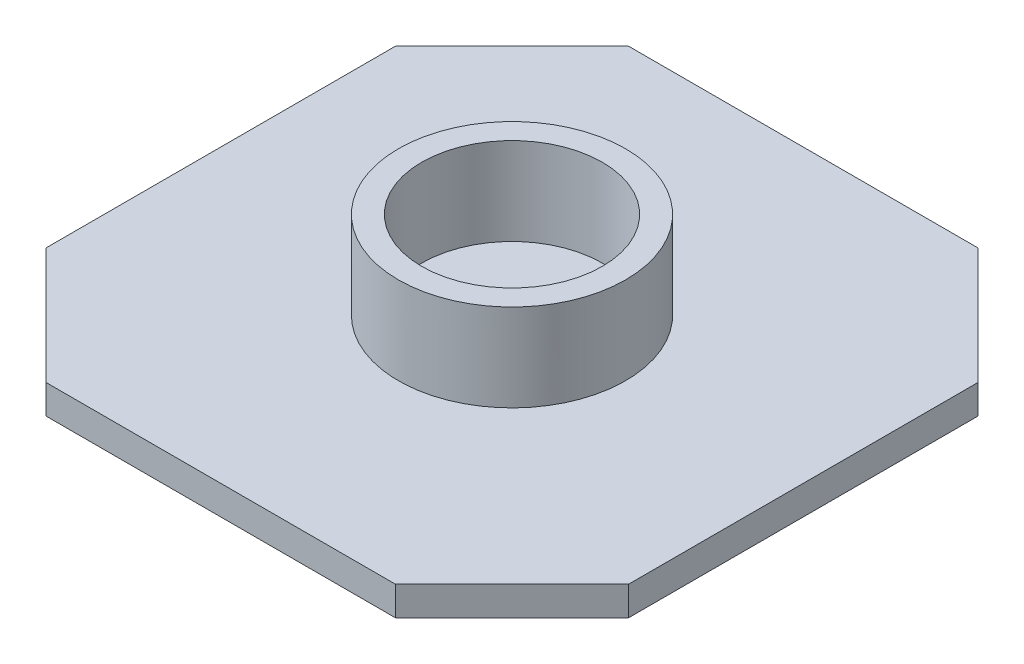
ISO-10303-21;
HEADER;
FILE_DESCRIPTION(('STEP AP214'),'2;1');
FILE_NAME('part.step','',(''),(''),'','','');
FILE_SCHEMA(('AUTOMOTIVE_DESIGN { 1 0 10303 214 1 1 1 1 }'));
ENDSEC;
DATA;
#1=APPLICATION_CONTEXT('core data for automotive mechanical design processes');
#2=APPLICATION_PROTOCOL_DEFINITION('international standard','automotive_design',2000,#1);
#3=PRODUCT_CONTEXT('',#1,'mechanical');
#4=PRODUCT('Part','Part','',(#3));
#5=PRODUCT_RELATED_PRODUCT_CATEGORY('part','',(#4));
#6=PRODUCT_DEFINITION_FORMATION('','',#4);
#7=PRODUCT_DEFINITION_CONTEXT('part definition',#1,'design');
#8=PRODUCT_DEFINITION('design','',#6,#7);
#9=PRODUCT_DEFINITION_SHAPE('','',#8);
#10=(LENGTH_UNIT() NAMED_UNIT(*) SI_UNIT(.MILLI.,.METRE.));
#11=(NAMED_UNIT(*) PLANE_ANGLE_UNIT() SI_UNIT($,.RADIAN.));
#12=(NAMED_UNIT(*) SI_UNIT($,.STERADIAN.) SOLID_ANGLE_UNIT());
#13=UNCERTAINTY_MEASURE_WITH_UNIT(LENGTH_MEASURE(1.E-05),#10,'distance_accuracy_value','');
#14=(GEOMETRIC_REPRESENTATION_CONTEXT(3) GLOBAL_UNCERTAINTY_ASSIGNED_CONTEXT((#13)) GLOBAL_UNIT_ASSIGNED_CONTEXT((#10,
#11,#12)) REPRESENTATION_CONTEXT('',''));
#15=CARTESIAN_POINT('',(0.,0.,0.));
#16=DIRECTION('',(0.,0.,1.));
#17=DIRECTION('',(1.,0.,0.));
#18=AXIS2_PLACEMENT_3D('',#15,#16,#17);
#19=CARTESIAN_POINT('',(10.,1.,10.));
#20=DIRECTION('',(-1.,0.,0.));
#21=DIRECTION('',(0.,0.,1.));
#22=AXIS2_PLACEMENT_3D('',#19,#20,#21);
#23=PLANE('',#22);
#24=DIRECTION('',(0.,0.,-1.));
#25=VECTOR('',#24,1.);
#26=CARTESIAN_POINT('',(10.,0.,10.));
#27=LINE('',#26,#25);
#28=CARTESIAN_POINT('',(10.,0.,6.));
#29=VERTEX_POINT('',#28);
#30=CARTESIAN_POINT('',(10.,0.,-5.99999999999999));
#31=VERTEX_POINT('',#30);
#32=EDGE_CURVE('E130',#29,#31,#27,.T.);
#33=ORIENTED_EDGE('',*,*,#32,.T.);
#34=DIRECTION('',(0.,1.,0.));
#35=VECTOR('',#34,1.);
#36=CARTESIAN_POINT('',(10.,1.,-5.99999999999999));
#37=LINE('',#36,#35);
#38=CARTESIAN_POINT('',(10.,1.,-5.99999999999999));
#39=VERTEX_POINT('',#38);
#40=EDGE_CURVE('E156',#31,#39,#37,.T.);
#41=ORIENTED_EDGE('',*,*,#40,.T.);
#42=DIRECTION('',(0.,0.,-1.));
#43=VECTOR('',#42,1.);
#44=CARTESIAN_POINT('',(10.,1.,10.));
#45=LINE('',#44,#43);
#46=CARTESIAN_POINT('',(10.,1.,6.));
#47=VERTEX_POINT('',#46);
#48=EDGE_CURVE('E128',#47,#39,#45,.T.);
#49=ORIENTED_EDGE('',*,*,#48,.F.);
#50=DIRECTION('',(0.,-1.,0.));
#51=VECTOR('',#50,1.);
#52=CARTESIAN_POINT('',(10.,1.,6.));
#53=LINE('',#52,#51);
#54=EDGE_CURVE('E153',#47,#29,#53,.T.);
#55=ORIENTED_EDGE('',*,*,#54,.T.);
#56=EDGE_LOOP('',(#33,#41,#49,#55));
#57=FACE_BOUND('',#56,.T.);
#58=ADVANCED_FACE('F35',(#57),#23,.F.);
#59=CARTESIAN_POINT('',(-10.,1.,-10.));
#60=DIRECTION('',(0.,0.,1.));
#61=DIRECTION('',(1.,0.,0.));
#62=AXIS2_PLACEMENT_3D('',#59,#60,#61);
#63=PLANE('',#62);
#64=DIRECTION('',(-1.,0.,0.));
#65=VECTOR('',#64,1.);
#66=CARTESIAN_POINT('',(-10.,0.,-10.));
#67=LINE('',#66,#65);
#68=CARTESIAN_POINT('',(6.,0.,-10.));
#69=VERTEX_POINT('',#68);
#70=CARTESIAN_POINT('',(-5.99999999999999,0.,-10.));
#71=VERTEX_POINT('',#70);
#72=EDGE_CURVE('E126',#69,#71,#67,.T.);
#73=ORIENTED_EDGE('',*,*,#72,.T.);
#74=DIRECTION('',(0.,1.,0.));
#75=VECTOR('',#74,1.);
#76=CARTESIAN_POINT('',(-5.99999999999999,1.,-10.));
#77=LINE('',#76,#75);
#78=CARTESIAN_POINT('',(-5.99999999999999,1.,-10.));
#79=VERTEX_POINT('',#78);
#80=EDGE_CURVE('E105',#71,#79,#77,.T.);
#81=ORIENTED_EDGE('',*,*,#80,.T.);
#82=DIRECTION('',(-1.,0.,0.));
#83=VECTOR('',#82,1.);
#84=CARTESIAN_POINT('',(-10.,1.,-10.));
#85=LINE('',#84,#83);
#86=CARTESIAN_POINT('',(6.,1.,-10.));
#87=VERTEX_POINT('',#86);
#88=EDGE_CURVE('E172',#87,#79,#85,.T.);
#89=ORIENTED_EDGE('',*,*,#88,.F.);
#90=DIRECTION('',(0.,-1.,0.));
#91=VECTOR('',#90,1.);
#92=CARTESIAN_POINT('',(6.,1.,-10.));
#93=LINE('',#92,#91);
#94=EDGE_CURVE('E110',#87,#69,#93,.T.);
#95=ORIENTED_EDGE('',*,*,#94,.T.);
#96=EDGE_LOOP('',(#73,#81,#89,#95));
#97=FACE_BOUND('',#96,.T.);
#98=ADVANCED_FACE('F210',(#97),#63,.F.);
#99=CARTESIAN_POINT('',(-10.,1.,10.));
#100=DIRECTION('',(1.,0.,0.));
#101=DIRECTION('',(0.,0.,-1.));
#102=AXIS2_PLACEMENT_3D('',#99,#100,#101);
#103=PLANE('',#102);
#104=DIRECTION('',(0.,0.,1.));
#105=VECTOR('',#104,1.);
#106=CARTESIAN_POINT('',(-10.,1.,10.));
#107=LINE('',#106,#105);
#108=CARTESIAN_POINT('',(-10.,1.,-6.00000000000001));
#109=VERTEX_POINT('',#108);
#110=CARTESIAN_POINT('',(-10.,1.,5.99999999999998));
#111=VERTEX_POINT('',#110);
#112=EDGE_CURVE('E119',#109,#111,#107,.T.);
#113=ORIENTED_EDGE('',*,*,#112,.F.);
#114=DIRECTION('',(0.,-1.,0.));
#115=VECTOR('',#114,1.);
#116=CARTESIAN_POINT('',(-10.,1.,-6.00000000000001));
#117=LINE('',#116,#115);
#118=CARTESIAN_POINT('',(-10.,0.,-6.00000000000001));
#119=VERTEX_POINT('',#118);
#120=EDGE_CURVE('E104',#109,#119,#117,.T.);
#121=ORIENTED_EDGE('',*,*,#120,.T.);
#122=DIRECTION('',(0.,0.,1.));
#123=VECTOR('',#122,1.);
#124=CARTESIAN_POINT('',(-10.,0.,10.));
#125=LINE('',#124,#123);
#126=CARTESIAN_POINT('',(-10.,0.,5.99999999999998));
#127=VERTEX_POINT('',#126);
#128=EDGE_CURVE('E117',#119,#127,#125,.T.);
#129=ORIENTED_EDGE('',*,*,#128,.T.);
#130=DIRECTION('',(0.,1.,0.));
#131=VECTOR('',#130,1.);
#132=CARTESIAN_POINT('',(-10.,1.,5.99999999999998));
#133=LINE('',#132,#131);
#134=EDGE_CURVE('E121',#127,#111,#133,.T.);
#135=ORIENTED_EDGE('',*,*,#134,.T.);
#136=EDGE_LOOP('',(#113,#121,#129,#135));
#137=FACE_BOUND('',#136,.T.);
#138=ADVANCED_FACE('F116',(#137),#103,.F.);
#139=CARTESIAN_POINT('',(-10.,1.,10.));
#140=DIRECTION('',(0.,0.,-1.));
#141=DIRECTION('',(-1.,0.,0.));
#142=AXIS2_PLACEMENT_3D('',#139,#140,#141);
#143=PLANE('',#142);
#144=DIRECTION('',(1.,0.,0.));
#145=VECTOR('',#144,1.);
#146=CARTESIAN_POINT('',(-10.,0.,10.));
#147=LINE('',#146,#145);
#148=CARTESIAN_POINT('',(-6.,0.,10.));
#149=VERTEX_POINT('',#148);
#150=CARTESIAN_POINT('',(5.99999999999999,0.,10.));
#151=VERTEX_POINT('',#150);
#152=EDGE_CURVE('E125',#149,#151,#147,.T.);
#153=ORIENTED_EDGE('',*,*,#152,.T.);
#154=DIRECTION('',(0.,1.,0.));
#155=VECTOR('',#154,1.);
#156=CARTESIAN_POINT('',(5.99999999999999,1.,10.));
#157=LINE('',#156,#155);
#158=CARTESIAN_POINT('',(5.99999999999999,1.,10.));
#159=VERTEX_POINT('',#158);
#160=EDGE_CURVE('E11',#151,#159,#157,.T.);
#161=ORIENTED_EDGE('',*,*,#160,.T.);
#162=DIRECTION('',(1.,0.,0.));
#163=VECTOR('',#162,1.);
#164=CARTESIAN_POINT('',(-10.,1.,10.));
#165=LINE('',#164,#163);
#166=CARTESIAN_POINT('',(-6.,1.,10.));
#167=VERTEX_POINT('',#166);
#168=EDGE_CURVE('E137',#167,#159,#165,.T.);
#169=ORIENTED_EDGE('',*,*,#168,.F.);
#170=DIRECTION('',(0.,-1.,0.));
#171=VECTOR('',#170,1.);
#172=CARTESIAN_POINT('',(-6.,1.,10.));
#173=LINE('',#172,#171);
#174=EDGE_CURVE('E43',#167,#149,#173,.T.);
#175=ORIENTED_EDGE('',*,*,#174,.T.);
#176=EDGE_LOOP('',(#153,#161,#169,#175));
#177=FACE_BOUND('',#176,.T.);
#178=ADVANCED_FACE('F159',(#177),#143,.F.);
#179=CARTESIAN_POINT('',(0.,1.,0.));
#180=DIRECTION('',(0.,-1.,0.));
#181=DIRECTION('',(0.,0.,-1.));
#182=AXIS2_PLACEMENT_3D('',#179,#180,#181);
#183=PLANE('',#182);
#184=CARTESIAN_POINT('',(0.,1.,0.));
#185=DIRECTION('',(0.,-1.,0.));
#186=DIRECTION('',(0.,0.,-1.));
#187=AXIS2_PLACEMENT_3D('',#184,#185,#186);
#188=CIRCLE('',#187,3.9);
#189=CARTESIAN_POINT('',(0.,1.,-3.9));
#190=VERTEX_POINT('',#189);
#191=EDGE_CURVE('E134',#190,#190,#188,.F.);
#192=ORIENTED_EDGE('',*,*,#191,.F.);
#193=EDGE_LOOP('',(#192));
#194=FACE_BOUND('',#193,.T.);
#195=ORIENTED_EDGE('',*,*,#88,.T.);
#196=DIRECTION('',(0.707106781186549,0.,-0.707106781186546));
#197=VECTOR('',#196,1.);
#198=CARTESIAN_POINT('',(-10.,1.,-6.00000000000001));
#199=LINE('',#198,#197);
#200=EDGE_CURVE('E151',#79,#109,#199,.F.);
#201=ORIENTED_EDGE('',*,*,#200,.T.);
#202=ORIENTED_EDGE('',*,*,#112,.T.);
#203=DIRECTION('',(-0.707106781186546,0.,-0.707106781186549));
#204=VECTOR('',#203,1.);
#205=CARTESIAN_POINT('',(-6.,1.,10.));
#206=LINE('',#205,#204);
#207=EDGE_CURVE('E55',#111,#167,#206,.F.);
#208=ORIENTED_EDGE('',*,*,#207,.T.);
#209=ORIENTED_EDGE('',*,*,#168,.T.);
#210=DIRECTION('',(-0.707106781186549,0.,0.707106781186546));
#211=VECTOR('',#210,1.);
#212=CARTESIAN_POINT('',(10.,1.,6.));
#213=LINE('',#212,#211);
#214=EDGE_CURVE('E147',#159,#47,#213,.F.);
#215=ORIENTED_EDGE('',*,*,#214,.T.);
#216=ORIENTED_EDGE('',*,*,#48,.T.);
#217=DIRECTION('',(0.707106781186546,0.,0.707106781186549));
#218=VECTOR('',#217,1.);
#219=CARTESIAN_POINT('',(6.,1.,-10.));
#220=LINE('',#219,#218);
#221=EDGE_CURVE('E149',#39,#87,#220,.F.);
#222=ORIENTED_EDGE('',*,*,#221,.T.);
#223=EDGE_LOOP('',(#195,#201,#202,#208,#209,#215,#216,#222));
#224=FACE_BOUND('',#223,.T.);
#225=ADVANCED_FACE('F204',(#194,#224),#183,.F.);
#226=CARTESIAN_POINT('',(0.,0.,0.));
#227=DIRECTION('',(0.,-1.,0.));
#228=DIRECTION('',(0.,0.,-1.));
#229=AXIS2_PLACEMENT_3D('',#226,#227,#228);
#230=PLANE('',#229);
#231=ORIENTED_EDGE('',*,*,#128,.F.);
#232=DIRECTION('',(-0.707106781186549,0.,0.707106781186546));
#233=VECTOR('',#232,1.);
#234=CARTESIAN_POINT('',(-7.99999999999998,0.,-8.00000000000001));
#235=LINE('',#234,#233);
#236=EDGE_CURVE('E100',#119,#71,#235,.F.);
#237=ORIENTED_EDGE('',*,*,#236,.T.);
#238=ORIENTED_EDGE('',*,*,#72,.F.);
#239=DIRECTION('',(-0.707106781186546,0.,-0.707106781186549));
#240=VECTOR('',#239,1.);
#241=CARTESIAN_POINT('',(8.00000000000001,0.,-7.99999999999998));
#242=LINE('',#241,#240);
#243=EDGE_CURVE('E111',#69,#31,#242,.F.);
#244=ORIENTED_EDGE('',*,*,#243,.T.);
#245=ORIENTED_EDGE('',*,*,#32,.F.);
#246=DIRECTION('',(0.707106781186549,0.,-0.707106781186546));
#247=VECTOR('',#246,1.);
#248=CARTESIAN_POINT('',(7.99999999999998,0.,8.00000000000001));
#249=LINE('',#248,#247);
#250=EDGE_CURVE('E140',#29,#151,#249,.F.);
#251=ORIENTED_EDGE('',*,*,#250,.T.);
#252=ORIENTED_EDGE('',*,*,#152,.F.);
#253=DIRECTION('',(0.707106781186546,0.,0.707106781186549));
#254=VECTOR('',#253,1.);
#255=CARTESIAN_POINT('',(-8.00000000000001,0.,7.99999999999998));
#256=LINE('',#255,#254);
#257=EDGE_CURVE('E120',#149,#127,#256,.F.);
#258=ORIENTED_EDGE('',*,*,#257,.T.);
#259=EDGE_LOOP('',(#231,#237,#238,#244,#245,#251,#252,#258));
#260=FACE_BOUND('',#259,.T.);
#261=ADVANCED_FACE('F123',(#260),#230,.T.);
#262=CARTESIAN_POINT('',(0.,4.,0.));
#263=DIRECTION('',(0.,1.,0.));
#264=DIRECTION('',(0.,0.,1.));
#265=AXIS2_PLACEMENT_3D('',#262,#263,#264);
#266=PLANE('',#265);
#267=CARTESIAN_POINT('',(0.,4.,0.));
#268=DIRECTION('',(0.,1.,0.));
#269=DIRECTION('',(0.,0.,1.));
#270=AXIS2_PLACEMENT_3D('',#267,#268,#269);
#271=CIRCLE('',#270,3.9);
#272=CARTESIAN_POINT('',(0.,4.,3.9));
#273=VERTEX_POINT('',#272);
#274=EDGE_CURVE('E177',#273,#273,#271,.T.);
#275=ORIENTED_EDGE('',*,*,#274,.T.);
#276=EDGE_LOOP('',(#275));
#277=FACE_BOUND('',#276,.T.);
#278=CARTESIAN_POINT('',(0.,4.,0.));
#279=DIRECTION('',(0.,1.,0.));
#280=DIRECTION('',(0.,0.,1.));
#281=AXIS2_PLACEMENT_3D('',#278,#279,#280);
#282=CIRCLE('',#281,3.1);
#283=CARTESIAN_POINT('',(0.,4.,3.1));
#284=VERTEX_POINT('',#283);
#285=EDGE_CURVE('E182',#284,#284,#282,.T.);
#286=ORIENTED_EDGE('',*,*,#285,.F.);
#287=EDGE_LOOP('',(#286));
#288=FACE_BOUND('',#287,.T.);
#289=ADVANCED_FACE('F205',(#277,#288),#266,.T.);
#290=CARTESIAN_POINT('',(0.,4.,0.));
#291=DIRECTION('',(0.,-1.,0.));
#292=DIRECTION('',(0.,0.,-1.));
#293=AXIS2_PLACEMENT_3D('',#290,#291,#292);
#294=CYLINDRICAL_SURFACE('',#293,3.9);
#295=ORIENTED_EDGE('',*,*,#274,.F.);
#296=EDGE_LOOP('',(#295));
#297=FACE_BOUND('',#296,.T.);
#298=ORIENTED_EDGE('',*,*,#191,.T.);
#299=EDGE_LOOP('',(#298));
#300=FACE_BOUND('',#299,.T.);
#301=ADVANCED_FACE('F197',(#297,#300),#294,.T.);
#302=CARTESIAN_POINT('',(0.,4.,0.));
#303=DIRECTION('',(0.,-1.,0.));
#304=DIRECTION('',(0.,0.,-1.));
#305=AXIS2_PLACEMENT_3D('',#302,#303,#304);
#306=CYLINDRICAL_SURFACE('',#305,3.1);
#307=ORIENTED_EDGE('',*,*,#285,.T.);
#308=EDGE_LOOP('',(#307));
#309=FACE_BOUND('',#308,.T.);
#310=CARTESIAN_POINT('',(0.,1.,0.));
#311=DIRECTION('',(0.,1.,0.));
#312=DIRECTION('',(0.,0.,1.));
#313=AXIS2_PLACEMENT_3D('',#310,#311,#312);
#314=CIRCLE('',#313,3.1);
#315=CARTESIAN_POINT('',(0.,1.,3.1));
#316=VERTEX_POINT('',#315);
#317=EDGE_CURVE('E186',#316,#316,#314,.T.);
#318=ORIENTED_EDGE('',*,*,#317,.F.);
#319=EDGE_LOOP('',(#318));
#320=FACE_BOUND('',#319,.T.);
#321=ADVANCED_FACE('F195',(#309,#320),#306,.F.);
#322=ORIENTED_EDGE('',*,*,#317,.T.);
#323=EDGE_LOOP('',(#322));
#324=FACE_BOUND('',#323,.T.);
#325=ADVANCED_FACE('F193',(#324),#183,.F.);
#326=CARTESIAN_POINT('',(-10.,1.,-6.00000000000001));
#327=DIRECTION('',(0.707106781186546,0.,0.707106781186549));
#328=DIRECTION('',(0.,-1.,0.));
#329=AXIS2_PLACEMENT_3D('',#326,#327,#328);
#330=PLANE('',#329);
#331=ORIENTED_EDGE('',*,*,#200,.F.);
#332=ORIENTED_EDGE('',*,*,#80,.F.);
#333=ORIENTED_EDGE('',*,*,#236,.F.);
#334=ORIENTED_EDGE('',*,*,#120,.F.);
#335=EDGE_LOOP('',(#331,#332,#333,#334));
#336=FACE_BOUND('',#335,.T.);
#337=ADVANCED_FACE('F103',(#336),#330,.F.);
#338=CARTESIAN_POINT('',(6.,1.,-10.));
#339=DIRECTION('',(-0.707106781186549,0.,0.707106781186546));
#340=DIRECTION('',(0.,-1.,0.));
#341=AXIS2_PLACEMENT_3D('',#338,#339,#340);
#342=PLANE('',#341);
#343=ORIENTED_EDGE('',*,*,#221,.F.);
#344=ORIENTED_EDGE('',*,*,#40,.F.);
#345=ORIENTED_EDGE('',*,*,#243,.F.);
#346=ORIENTED_EDGE('',*,*,#94,.F.);
#347=EDGE_LOOP('',(#343,#344,#345,#346));
#348=FACE_BOUND('',#347,.T.);
#349=ADVANCED_FACE('F221',(#348),#342,.F.);
#350=CARTESIAN_POINT('',(10.,1.,6.));
#351=DIRECTION('',(-0.707106781186546,0.,-0.707106781186549));
#352=DIRECTION('',(0.,-1.,0.));
#353=AXIS2_PLACEMENT_3D('',#350,#351,#352);
#354=PLANE('',#353);
#355=ORIENTED_EDGE('',*,*,#214,.F.);
#356=ORIENTED_EDGE('',*,*,#160,.F.);
#357=ORIENTED_EDGE('',*,*,#250,.F.);
#358=ORIENTED_EDGE('',*,*,#54,.F.);
#359=EDGE_LOOP('',(#355,#356,#357,#358));
#360=FACE_BOUND('',#359,.T.);
#361=ADVANCED_FACE('F166',(#360),#354,.F.);
#362=CARTESIAN_POINT('',(-6.,1.,10.));
#363=DIRECTION('',(0.707106781186549,0.,-0.707106781186546));
#364=DIRECTION('',(0.,-1.,0.));
#365=AXIS2_PLACEMENT_3D('',#362,#363,#364);
#366=PLANE('',#365);
#367=ORIENTED_EDGE('',*,*,#207,.F.);
#368=ORIENTED_EDGE('',*,*,#134,.F.);
#369=ORIENTED_EDGE('',*,*,#257,.F.);
#370=ORIENTED_EDGE('',*,*,#174,.F.);
#371=EDGE_LOOP('',(#367,#368,#369,#370));
#372=FACE_BOUND('',#371,.T.);
#373=ADVANCED_FACE('F37',(#372),#366,.F.);
#374=CLOSED_SHELL('',(#58,#98,#138,#178,#225,#261,#289,#301,#321,#325,#337,#349,#361,#373));
#375=MANIFOLD_SOLID_BREP('B2',#374);
#376=ADVANCED_BREP_SHAPE_REPRESENTATION('',(#18,#375),#14);
#377=SHAPE_DEFINITION_REPRESENTATION(#9,#376);
ENDSEC;
END-ISO-10303-21;
